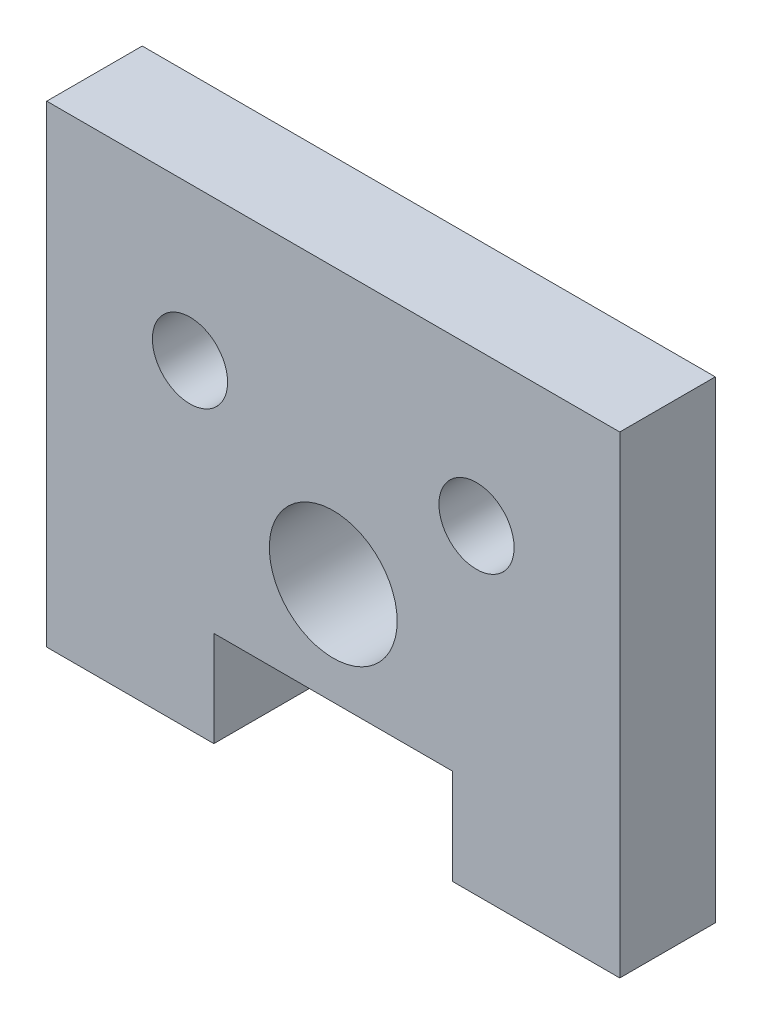
ISO-10303-21;
HEADER;
FILE_DESCRIPTION(('STEP AP214'),'2;1');
FILE_NAME('part.step','',(''),(''),'','','');
FILE_SCHEMA(('AUTOMOTIVE_DESIGN { 1 0 10303 214 1 1 1 1 }'));
ENDSEC;
DATA;
#1=APPLICATION_CONTEXT('core data for automotive mechanical design processes');
#2=APPLICATION_PROTOCOL_DEFINITION('international standard','automotive_design',2000,#1);
#3=PRODUCT_CONTEXT('',#1,'mechanical');
#4=PRODUCT('Part','Part','',(#3));
#5=PRODUCT_RELATED_PRODUCT_CATEGORY('part','',(#4));
#6=PRODUCT_DEFINITION_FORMATION('','',#4);
#7=PRODUCT_DEFINITION_CONTEXT('part definition',#1,'design');
#8=PRODUCT_DEFINITION('design','',#6,#7);
#9=PRODUCT_DEFINITION_SHAPE('','',#8);
#10=(LENGTH_UNIT() NAMED_UNIT(*) SI_UNIT(.MILLI.,.METRE.));
#11=(NAMED_UNIT(*) PLANE_ANGLE_UNIT() SI_UNIT($,.RADIAN.));
#12=(NAMED_UNIT(*) SI_UNIT($,.STERADIAN.) SOLID_ANGLE_UNIT());
#13=UNCERTAINTY_MEASURE_WITH_UNIT(LENGTH_MEASURE(1.E-05),#10,'distance_accuracy_value','');
#14=(GEOMETRIC_REPRESENTATION_CONTEXT(3) GLOBAL_UNCERTAINTY_ASSIGNED_CONTEXT((#13)) GLOBAL_UNIT_ASSIGNED_CONTEXT((#10,
#11,#12)) REPRESENTATION_CONTEXT('',''));
#15=CARTESIAN_POINT('',(0.,0.,0.));
#16=DIRECTION('',(0.,0.,1.));
#17=DIRECTION('',(1.,0.,0.));
#18=AXIS2_PLACEMENT_3D('',#15,#16,#17);
#19=CARTESIAN_POINT('',(-15.875,0.,12.7));
#20=DIRECTION('',(-1.,0.,0.));
#21=DIRECTION('',(0.,0.,1.));
#22=AXIS2_PLACEMENT_3D('',#19,#20,#21);
#23=PLANE('',#22);
#24=DIRECTION('',(0.,1.,0.));
#25=VECTOR('',#24,1.);
#26=CARTESIAN_POINT('',(-15.875,0.,0.));
#27=LINE('',#26,#25);
#28=CARTESIAN_POINT('',(-15.875,-34.544,0.));
#29=VERTEX_POINT('',#28);
#30=CARTESIAN_POINT('',(-15.875,-21.844,0.));
#31=VERTEX_POINT('',#30);
#32=EDGE_CURVE('E141',#29,#31,#27,.T.);
#33=ORIENTED_EDGE('',*,*,#32,.T.);
#34=DIRECTION('',(0.,0.,-1.));
#35=VECTOR('',#34,1.);
#36=CARTESIAN_POINT('',(-15.875,-21.844,12.7));
#37=LINE('',#36,#35);
#38=CARTESIAN_POINT('',(-15.875,-21.844,12.7));
#39=VERTEX_POINT('',#38);
#40=EDGE_CURVE('E11',#39,#31,#37,.T.);
#41=ORIENTED_EDGE('',*,*,#40,.F.);
#42=DIRECTION('',(0.,1.,0.));
#43=VECTOR('',#42,1.);
#44=CARTESIAN_POINT('',(-15.875,0.,12.7));
#45=LINE('',#44,#43);
#46=CARTESIAN_POINT('',(-15.875,-34.544,12.7));
#47=VERTEX_POINT('',#46);
#48=EDGE_CURVE('E186',#47,#39,#45,.T.);
#49=ORIENTED_EDGE('',*,*,#48,.F.);
#50=DIRECTION('',(0.,0.,-1.));
#51=VECTOR('',#50,1.);
#52=CARTESIAN_POINT('',(-15.875,-34.544,12.7));
#53=LINE('',#52,#51);
#54=EDGE_CURVE('E51',#47,#29,#53,.T.);
#55=ORIENTED_EDGE('',*,*,#54,.T.);
#56=EDGE_LOOP('',(#33,#41,#49,#55));
#57=FACE_BOUND('',#56,.T.);
#58=ADVANCED_FACE('F34',(#57),#23,.F.);
#59=CARTESIAN_POINT('',(0.,-21.844,12.7));
#60=DIRECTION('',(0.,1.,0.));
#61=DIRECTION('',(-1.,0.,0.));
#62=AXIS2_PLACEMENT_3D('',#59,#60,#61);
#63=PLANE('',#62);
#64=DIRECTION('',(1.,0.,0.));
#65=VECTOR('',#64,1.);
#66=CARTESIAN_POINT('',(0.,-21.844,0.));
#67=LINE('',#66,#65);
#68=CARTESIAN_POINT('',(15.875,-21.844,0.));
#69=VERTEX_POINT('',#68);
#70=EDGE_CURVE('E143',#31,#69,#67,.T.);
#71=ORIENTED_EDGE('',*,*,#70,.T.);
#72=DIRECTION('',(0.,0.,-1.));
#73=VECTOR('',#72,1.);
#74=CARTESIAN_POINT('',(15.875,-21.844,12.7));
#75=LINE('',#74,#73);
#76=CARTESIAN_POINT('',(15.875,-21.844,12.7));
#77=VERTEX_POINT('',#76);
#78=EDGE_CURVE('E43',#77,#69,#75,.T.);
#79=ORIENTED_EDGE('',*,*,#78,.F.);
#80=DIRECTION('',(1.,0.,0.));
#81=VECTOR('',#80,1.);
#82=CARTESIAN_POINT('',(0.,-21.844,12.7));
#83=LINE('',#82,#81);
#84=EDGE_CURVE('E89',#39,#77,#83,.T.);
#85=ORIENTED_EDGE('',*,*,#84,.F.);
#86=ORIENTED_EDGE('',*,*,#40,.T.);
#87=EDGE_LOOP('',(#71,#79,#85,#86));
#88=FACE_BOUND('',#87,.T.);
#89=ADVANCED_FACE('F222',(#88),#63,.F.);
#90=CARTESIAN_POINT('',(15.875,0.,12.7));
#91=DIRECTION('',(1.,0.,0.));
#92=DIRECTION('',(0.,0.,-1.));
#93=AXIS2_PLACEMENT_3D('',#90,#91,#92);
#94=PLANE('',#93);
#95=DIRECTION('',(0.,-1.,0.));
#96=VECTOR('',#95,1.);
#97=CARTESIAN_POINT('',(15.875,0.,0.));
#98=LINE('',#97,#96);
#99=CARTESIAN_POINT('',(15.875,-34.544,0.));
#100=VERTEX_POINT('',#99);
#101=EDGE_CURVE('E145',#69,#100,#98,.T.);
#102=ORIENTED_EDGE('',*,*,#101,.T.);
#103=DIRECTION('',(0.,0.,-1.));
#104=VECTOR('',#103,1.);
#105=CARTESIAN_POINT('',(15.875,-34.544,12.7));
#106=LINE('',#105,#104);
#107=CARTESIAN_POINT('',(15.875,-34.544,12.7));
#108=VERTEX_POINT('',#107);
#109=EDGE_CURVE('E166',#108,#100,#106,.T.);
#110=ORIENTED_EDGE('',*,*,#109,.F.);
#111=DIRECTION('',(0.,-1.,0.));
#112=VECTOR('',#111,1.);
#113=CARTESIAN_POINT('',(15.875,0.,12.7));
#114=LINE('',#113,#112);
#115=EDGE_CURVE('E173',#77,#108,#114,.T.);
#116=ORIENTED_EDGE('',*,*,#115,.F.);
#117=ORIENTED_EDGE('',*,*,#78,.T.);
#118=EDGE_LOOP('',(#102,#110,#116,#117));
#119=FACE_BOUND('',#118,.T.);
#120=ADVANCED_FACE('F171',(#119),#94,.F.);
#121=CARTESIAN_POINT('',(0.,-34.544,12.7));
#122=DIRECTION('',(0.,-1.,0.));
#123=DIRECTION('',(0.,0.,-1.));
#124=AXIS2_PLACEMENT_3D('',#121,#122,#123);
#125=PLANE('',#124);
#126=DIRECTION('',(-1.,0.,0.));
#127=VECTOR('',#126,1.);
#128=CARTESIAN_POINT('',(0.,-34.544,0.));
#129=LINE('',#128,#127);
#130=CARTESIAN_POINT('',(38.1,-34.544,0.));
#131=VERTEX_POINT('',#130);
#132=EDGE_CURVE('E148',#131,#100,#129,.T.);
#133=ORIENTED_EDGE('',*,*,#132,.F.);
#134=DIRECTION('',(0.,0.,-1.));
#135=VECTOR('',#134,1.);
#136=CARTESIAN_POINT('',(38.1,-34.544,12.7));
#137=LINE('',#136,#135);
#138=CARTESIAN_POINT('',(38.1,-34.544,12.7));
#139=VERTEX_POINT('',#138);
#140=EDGE_CURVE('E164',#139,#131,#137,.T.);
#141=ORIENTED_EDGE('',*,*,#140,.F.);
#142=DIRECTION('',(-1.,0.,0.));
#143=VECTOR('',#142,1.);
#144=CARTESIAN_POINT('',(0.,-34.544,12.7));
#145=LINE('',#144,#143);
#146=EDGE_CURVE('E181',#139,#108,#145,.T.);
#147=ORIENTED_EDGE('',*,*,#146,.T.);
#148=ORIENTED_EDGE('',*,*,#109,.T.);
#149=EDGE_LOOP('',(#133,#141,#147,#148));
#150=FACE_BOUND('',#149,.T.);
#151=ADVANCED_FACE('F179',(#150),#125,.T.);
#152=CARTESIAN_POINT('',(38.1,0.,12.7));
#153=DIRECTION('',(-1.,0.,0.));
#154=DIRECTION('',(0.,0.,1.));
#155=AXIS2_PLACEMENT_3D('',#152,#153,#154);
#156=PLANE('',#155);
#157=DIRECTION('',(0.,1.,0.));
#158=VECTOR('',#157,1.);
#159=CARTESIAN_POINT('',(38.1,0.,0.));
#160=LINE('',#159,#158);
#161=CARTESIAN_POINT('',(38.1,28.3363680824292,0.));
#162=VERTEX_POINT('',#161);
#163=EDGE_CURVE('E151',#131,#162,#160,.T.);
#164=ORIENTED_EDGE('',*,*,#163,.T.);
#165=DIRECTION('',(0.,0.,-1.));
#166=VECTOR('',#165,1.);
#167=CARTESIAN_POINT('',(38.1,28.3363680824292,12.7));
#168=LINE('',#167,#166);
#169=CARTESIAN_POINT('',(38.1,28.3363680824292,12.7));
#170=VERTEX_POINT('',#169);
#171=EDGE_CURVE('E114',#170,#162,#168,.T.);
#172=ORIENTED_EDGE('',*,*,#171,.F.);
#173=DIRECTION('',(0.,1.,0.));
#174=VECTOR('',#173,1.);
#175=CARTESIAN_POINT('',(38.1,0.,12.7));
#176=LINE('',#175,#174);
#177=EDGE_CURVE('E123',#139,#170,#176,.T.);
#178=ORIENTED_EDGE('',*,*,#177,.F.);
#179=ORIENTED_EDGE('',*,*,#140,.T.);
#180=EDGE_LOOP('',(#164,#172,#178,#179));
#181=FACE_BOUND('',#180,.T.);
#182=ADVANCED_FACE('F246',(#181),#156,.F.);
#183=CARTESIAN_POINT('',(0.,28.3363680824292,12.7));
#184=DIRECTION('',(0.,1.,0.));
#185=DIRECTION('',(-1.,0.,0.));
#186=AXIS2_PLACEMENT_3D('',#183,#184,#185);
#187=PLANE('',#186);
#188=DIRECTION('',(1.,0.,0.));
#189=VECTOR('',#188,1.);
#190=CARTESIAN_POINT('',(0.,28.3363680824292,0.));
#191=LINE('',#190,#189);
#192=CARTESIAN_POINT('',(-38.1,28.3363680824292,0.));
#193=VERTEX_POINT('',#192);
#194=EDGE_CURVE('E110',#193,#162,#191,.T.);
#195=ORIENTED_EDGE('',*,*,#194,.F.);
#196=DIRECTION('',(0.,0.,-1.));
#197=VECTOR('',#196,1.);
#198=CARTESIAN_POINT('',(-38.1,28.3363680824292,12.7));
#199=LINE('',#198,#197);
#200=CARTESIAN_POINT('',(-38.1,28.3363680824292,12.7));
#201=VERTEX_POINT('',#200);
#202=EDGE_CURVE('E105',#201,#193,#199,.T.);
#203=ORIENTED_EDGE('',*,*,#202,.F.);
#204=DIRECTION('',(1.,0.,0.));
#205=VECTOR('',#204,1.);
#206=CARTESIAN_POINT('',(0.,28.3363680824292,12.7));
#207=LINE('',#206,#205);
#208=EDGE_CURVE('E108',#201,#170,#207,.T.);
#209=ORIENTED_EDGE('',*,*,#208,.T.);
#210=ORIENTED_EDGE('',*,*,#171,.T.);
#211=EDGE_LOOP('',(#195,#203,#209,#210));
#212=FACE_BOUND('',#211,.T.);
#213=ADVANCED_FACE('F107',(#212),#187,.T.);
#214=CARTESIAN_POINT('',(-38.1,0.,12.7));
#215=DIRECTION('',(-1.,0.,0.));
#216=DIRECTION('',(0.,0.,1.));
#217=AXIS2_PLACEMENT_3D('',#214,#215,#216);
#218=PLANE('',#217);
#219=DIRECTION('',(0.,1.,0.));
#220=VECTOR('',#219,1.);
#221=CARTESIAN_POINT('',(-38.1,0.,0.));
#222=LINE('',#221,#220);
#223=CARTESIAN_POINT('',(-38.1,-34.544,0.));
#224=VERTEX_POINT('',#223);
#225=EDGE_CURVE('E155',#224,#193,#222,.T.);
#226=ORIENTED_EDGE('',*,*,#225,.F.);
#227=DIRECTION('',(0.,0.,-1.));
#228=VECTOR('',#227,1.);
#229=CARTESIAN_POINT('',(-38.1,-34.544,12.7));
#230=LINE('',#229,#228);
#231=CARTESIAN_POINT('',(-38.1,-34.544,12.7));
#232=VERTEX_POINT('',#231);
#233=EDGE_CURVE('E77',#232,#224,#230,.T.);
#234=ORIENTED_EDGE('',*,*,#233,.F.);
#235=DIRECTION('',(0.,1.,0.));
#236=VECTOR('',#235,1.);
#237=CARTESIAN_POINT('',(-38.1,0.,12.7));
#238=LINE('',#237,#236);
#239=EDGE_CURVE('E120',#232,#201,#238,.T.);
#240=ORIENTED_EDGE('',*,*,#239,.T.);
#241=ORIENTED_EDGE('',*,*,#202,.T.);
#242=EDGE_LOOP('',(#226,#234,#240,#241));
#243=FACE_BOUND('',#242,.T.);
#244=ADVANCED_FACE('F126',(#243),#218,.T.);
#245=CARTESIAN_POINT('',(-19.05,7.99200000000001,12.7));
#246=DIRECTION('',(0.,0.,-1.));
#247=DIRECTION('',(-1.,0.,0.));
#248=AXIS2_PLACEMENT_3D('',#245,#246,#247);
#249=CYLINDRICAL_SURFACE('',#248,5.);
#250=CARTESIAN_POINT('',(-19.05,7.99200000000001,12.7));
#251=DIRECTION('',(0.,0.,1.));
#252=DIRECTION('',(1.,0.,0.));
#253=AXIS2_PLACEMENT_3D('',#250,#251,#252);
#254=CIRCLE('',#253,5.);
#255=CARTESIAN_POINT('',(-14.05,7.99200000000001,12.7));
#256=VERTEX_POINT('',#255);
#257=EDGE_CURVE('E188',#256,#256,#254,.T.);
#258=ORIENTED_EDGE('',*,*,#257,.T.);
#259=EDGE_LOOP('',(#258));
#260=FACE_BOUND('',#259,.T.);
#261=CARTESIAN_POINT('',(-19.05,7.99200000000001,0.));
#262=DIRECTION('',(0.,0.,1.));
#263=DIRECTION('',(1.,0.,0.));
#264=AXIS2_PLACEMENT_3D('',#261,#262,#263);
#265=CIRCLE('',#264,5.);
#266=CARTESIAN_POINT('',(-14.05,7.99200000000001,0.));
#267=VERTEX_POINT('',#266);
#268=EDGE_CURVE('E138',#267,#267,#265,.T.);
#269=ORIENTED_EDGE('',*,*,#268,.F.);
#270=EDGE_LOOP('',(#269));
#271=FACE_BOUND('',#270,.T.);
#272=ADVANCED_FACE('F207',(#260,#271),#249,.F.);
#273=CARTESIAN_POINT('',(19.05,7.99200000000001,12.7));
#274=DIRECTION('',(0.,0.,-1.));
#275=DIRECTION('',(-1.,0.,0.));
#276=AXIS2_PLACEMENT_3D('',#273,#274,#275);
#277=CYLINDRICAL_SURFACE('',#276,5.);
#278=CARTESIAN_POINT('',(19.05,7.99200000000001,12.7));
#279=DIRECTION('',(0.,0.,1.));
#280=DIRECTION('',(1.,0.,0.));
#281=AXIS2_PLACEMENT_3D('',#278,#279,#280);
#282=CIRCLE('',#281,5.);
#283=CARTESIAN_POINT('',(24.05,7.99200000000001,12.7));
#284=VERTEX_POINT('',#283);
#285=EDGE_CURVE('E191',#284,#284,#282,.T.);
#286=ORIENTED_EDGE('',*,*,#285,.T.);
#287=EDGE_LOOP('',(#286));
#288=FACE_BOUND('',#287,.T.);
#289=CARTESIAN_POINT('',(19.05,7.99200000000001,0.));
#290=DIRECTION('',(0.,0.,1.));
#291=DIRECTION('',(1.,0.,0.));
#292=AXIS2_PLACEMENT_3D('',#289,#290,#291);
#293=CIRCLE('',#292,5.);
#294=CARTESIAN_POINT('',(24.05,7.99200000000001,0.));
#295=VERTEX_POINT('',#294);
#296=EDGE_CURVE('E135',#295,#295,#293,.T.);
#297=ORIENTED_EDGE('',*,*,#296,.F.);
#298=EDGE_LOOP('',(#297));
#299=FACE_BOUND('',#298,.T.);
#300=ADVANCED_FACE('F210',(#288,#299),#277,.F.);
#301=CARTESIAN_POINT('',(0.,-8.26399999999999,12.7));
#302=DIRECTION('',(0.,0.,-1.));
#303=DIRECTION('',(-1.,0.,0.));
#304=AXIS2_PLACEMENT_3D('',#301,#302,#303);
#305=CYLINDRICAL_SURFACE('',#304,8.5);
#306=CARTESIAN_POINT('',(0.,-8.26399999999999,12.7));
#307=DIRECTION('',(0.,0.,1.));
#308=DIRECTION('',(1.,0.,0.));
#309=AXIS2_PLACEMENT_3D('',#306,#307,#308);
#310=CIRCLE('',#309,8.5);
#311=CARTESIAN_POINT('',(8.5,-8.26399999999999,12.7));
#312=VERTEX_POINT('',#311);
#313=EDGE_CURVE('E160',#312,#312,#310,.T.);
#314=ORIENTED_EDGE('',*,*,#313,.T.);
#315=EDGE_LOOP('',(#314));
#316=FACE_BOUND('',#315,.T.);
#317=CARTESIAN_POINT('',(0.,-8.26399999999999,0.));
#318=DIRECTION('',(0.,0.,1.));
#319=DIRECTION('',(1.,0.,0.));
#320=AXIS2_PLACEMENT_3D('',#317,#318,#319);
#321=CIRCLE('',#320,8.5);
#322=CARTESIAN_POINT('',(8.5,-8.26399999999999,0.));
#323=VERTEX_POINT('',#322);
#324=EDGE_CURVE('E132',#323,#323,#321,.T.);
#325=ORIENTED_EDGE('',*,*,#324,.F.);
#326=EDGE_LOOP('',(#325));
#327=FACE_BOUND('',#326,.T.);
#328=ADVANCED_FACE('F36',(#316,#327),#305,.F.);
#329=CARTESIAN_POINT('',(0.,-34.544,12.7));
#330=DIRECTION('',(0.,-1.,0.));
#331=DIRECTION('',(0.,0.,-1.));
#332=AXIS2_PLACEMENT_3D('',#329,#330,#331);
#333=PLANE('',#332);
#334=DIRECTION('',(-1.,0.,0.));
#335=VECTOR('',#334,1.);
#336=CARTESIAN_POINT('',(0.,-34.544,0.));
#337=LINE('',#336,#335);
#338=EDGE_CURVE('E157',#29,#224,#337,.T.);
#339=ORIENTED_EDGE('',*,*,#338,.F.);
#340=ORIENTED_EDGE('',*,*,#54,.F.);
#341=DIRECTION('',(-1.,0.,0.));
#342=VECTOR('',#341,1.);
#343=CARTESIAN_POINT('',(0.,-34.544,12.7));
#344=LINE('',#343,#342);
#345=EDGE_CURVE('E127',#47,#232,#344,.T.);
#346=ORIENTED_EDGE('',*,*,#345,.T.);
#347=ORIENTED_EDGE('',*,*,#233,.T.);
#348=EDGE_LOOP('',(#339,#340,#346,#347));
#349=FACE_BOUND('',#348,.T.);
#350=ADVANCED_FACE('F201',(#349),#333,.T.);
#351=CARTESIAN_POINT('',(0.,0.,12.7));
#352=DIRECTION('',(0.,0.,1.));
#353=DIRECTION('',(1.,0.,0.));
#354=AXIS2_PLACEMENT_3D('',#351,#352,#353);
#355=PLANE('',#354);
#356=ORIENTED_EDGE('',*,*,#313,.F.);
#357=EDGE_LOOP('',(#356));
#358=FACE_BOUND('',#357,.T.);
#359=ORIENTED_EDGE('',*,*,#285,.F.);
#360=EDGE_LOOP('',(#359));
#361=FACE_BOUND('',#360,.T.);
#362=ORIENTED_EDGE('',*,*,#257,.F.);
#363=EDGE_LOOP('',(#362));
#364=FACE_BOUND('',#363,.T.);
#365=ORIENTED_EDGE('',*,*,#48,.T.);
#366=ORIENTED_EDGE('',*,*,#84,.T.);
#367=ORIENTED_EDGE('',*,*,#115,.T.);
#368=ORIENTED_EDGE('',*,*,#146,.F.);
#369=ORIENTED_EDGE('',*,*,#177,.T.);
#370=ORIENTED_EDGE('',*,*,#208,.F.);
#371=ORIENTED_EDGE('',*,*,#239,.F.);
#372=ORIENTED_EDGE('',*,*,#345,.F.);
#373=EDGE_LOOP('',(#365,#366,#367,#368,#369,#370,#371,#372));
#374=FACE_BOUND('',#373,.T.);
#375=ADVANCED_FACE('F118',(#358,#361,#364,#374),#355,.T.);
#376=CARTESIAN_POINT('',(0.,0.,0.));
#377=DIRECTION('',(0.,0.,1.));
#378=DIRECTION('',(1.,0.,0.));
#379=AXIS2_PLACEMENT_3D('',#376,#377,#378);
#380=PLANE('',#379);
#381=ORIENTED_EDGE('',*,*,#324,.T.);
#382=EDGE_LOOP('',(#381));
#383=FACE_BOUND('',#382,.T.);
#384=ORIENTED_EDGE('',*,*,#296,.T.);
#385=EDGE_LOOP('',(#384));
#386=FACE_BOUND('',#385,.T.);
#387=ORIENTED_EDGE('',*,*,#268,.T.);
#388=EDGE_LOOP('',(#387));
#389=FACE_BOUND('',#388,.T.);
#390=ORIENTED_EDGE('',*,*,#32,.F.);
#391=ORIENTED_EDGE('',*,*,#338,.T.);
#392=ORIENTED_EDGE('',*,*,#225,.T.);
#393=ORIENTED_EDGE('',*,*,#194,.T.);
#394=ORIENTED_EDGE('',*,*,#163,.F.);
#395=ORIENTED_EDGE('',*,*,#132,.T.);
#396=ORIENTED_EDGE('',*,*,#101,.F.);
#397=ORIENTED_EDGE('',*,*,#70,.F.);
#398=EDGE_LOOP('',(#390,#391,#392,#393,#394,#395,#396,#397));
#399=FACE_BOUND('',#398,.T.);
#400=ADVANCED_FACE('F175',(#383,#386,#389,#399),#380,.F.);
#401=CLOSED_SHELL('',(#58,#89,#120,#151,#182,#213,#244,#272,#300,#328,#350,#375,#400));
#402=MANIFOLD_SOLID_BREP('B2',#401);
#403=ADVANCED_BREP_SHAPE_REPRESENTATION('',(#18,#402),#14);
#404=SHAPE_DEFINITION_REPRESENTATION(#9,#403);
ENDSEC;
END-ISO-10303-21;
